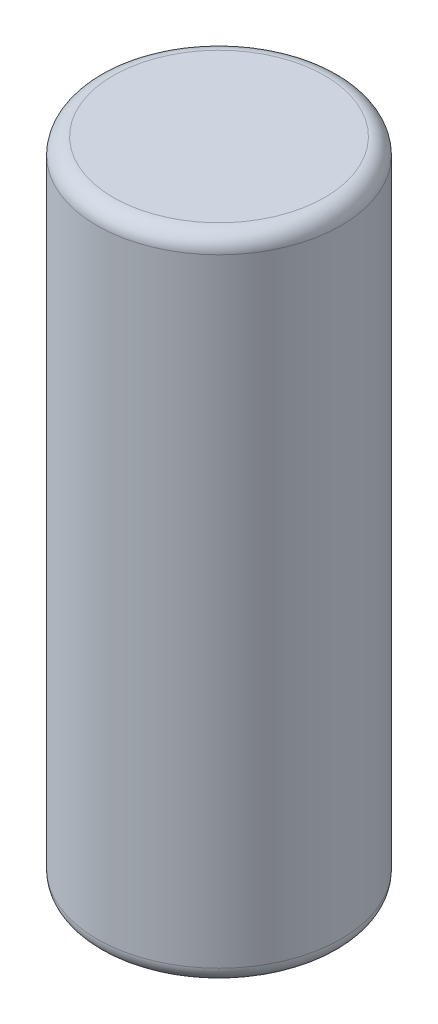
ISO-10303-21;
HEADER;
FILE_DESCRIPTION(('STEP AP214'),'2;1');
FILE_NAME('part.step','',(''),(''),'','','');
FILE_SCHEMA(('AUTOMOTIVE_DESIGN { 1 0 10303 214 1 1 1 1 }'));
ENDSEC;
DATA;
#1=APPLICATION_CONTEXT('core data for automotive mechanical design processes');
#2=APPLICATION_PROTOCOL_DEFINITION('international standard','automotive_design',2000,#1);
#3=PRODUCT_CONTEXT('',#1,'mechanical');
#4=PRODUCT('Part','Part','',(#3));
#5=PRODUCT_RELATED_PRODUCT_CATEGORY('part','',(#4));
#6=PRODUCT_DEFINITION_FORMATION('','',#4);
#7=PRODUCT_DEFINITION_CONTEXT('part definition',#1,'design');
#8=PRODUCT_DEFINITION('design','',#6,#7);
#9=PRODUCT_DEFINITION_SHAPE('','',#8);
#10=(LENGTH_UNIT() NAMED_UNIT(*) SI_UNIT(.MILLI.,.METRE.));
#11=(NAMED_UNIT(*) PLANE_ANGLE_UNIT() SI_UNIT($,.RADIAN.));
#12=(NAMED_UNIT(*) SI_UNIT($,.STERADIAN.) SOLID_ANGLE_UNIT());
#13=UNCERTAINTY_MEASURE_WITH_UNIT(LENGTH_MEASURE(1.E-05),#10,'distance_accuracy_value','');
#14=(GEOMETRIC_REPRESENTATION_CONTEXT(3) GLOBAL_UNCERTAINTY_ASSIGNED_CONTEXT((#13)) GLOBAL_UNIT_ASSIGNED_CONTEXT((#10,
#11,#12)) REPRESENTATION_CONTEXT('',''));
#15=CARTESIAN_POINT('',(0.,0.,0.));
#16=DIRECTION('',(0.,0.,1.));
#17=DIRECTION('',(1.,0.,0.));
#18=AXIS2_PLACEMENT_3D('',#15,#16,#17);
#19=CARTESIAN_POINT('',(0.,400.,0.));
#20=DIRECTION('',(0.,-1.,0.));
#21=DIRECTION('',(0.,0.,-1.));
#22=AXIS2_PLACEMENT_3D('',#19,#20,#21);
#23=CYLINDRICAL_SURFACE('',#22,75.);
#24=CARTESIAN_POINT('',(0.,10.,0.));
#25=DIRECTION('',(0.,1.,0.));
#26=DIRECTION('',(0.,0.,1.));
#27=AXIS2_PLACEMENT_3D('',#24,#25,#26);
#28=CIRCLE('',#27,75.);
#29=CARTESIAN_POINT('',(0.,10.,-75.));
#30=VERTEX_POINT('',#29);
#31=EDGE_CURVE('E43',#30,#30,#28,.T.);
#32=CARTESIAN_POINT('',(0.,390.,0.));
#33=DIRECTION('',(0.,1.,0.));
#34=DIRECTION('',(0.,0.,1.));
#35=AXIS2_PLACEMENT_3D('',#32,#33,#34);
#36=CIRCLE('',#35,75.);
#37=CARTESIAN_POINT('',(0.,390.,-75.));
#38=VERTEX_POINT('',#37);
#39=EDGE_CURVE('E47',#38,#38,#36,.F.);
#40=CARTESIAN_POINT('',(0.,10.,-75.));
#41=CARTESIAN_POINT('',(0.,13.9583333333333,-75.));
#42=CARTESIAN_POINT('',(0.,17.9166666666667,-75.));
#43=CARTESIAN_POINT('',(0.,25.8333333333334,-75.));
#44=CARTESIAN_POINT('',(0.,29.7916666666667,-75.));
#45=CARTESIAN_POINT('',(0.,37.7083333333333,-75.));
#46=CARTESIAN_POINT('',(0.,41.6666666666667,-75.));
#47=CARTESIAN_POINT('',(0.,49.5833333333334,-75.));
#48=CARTESIAN_POINT('',(0.,53.5416666666667,-75.));
#49=CARTESIAN_POINT('',(0.,61.4583333333334,-75.));
#50=CARTESIAN_POINT('',(0.,65.4166666666667,-75.));
#51=CARTESIAN_POINT('',(0.,73.3333333333334,-75.));
#52=CARTESIAN_POINT('',(0.,77.2916666666667,-75.));
#53=CARTESIAN_POINT('',(0.,85.2083333333334,-75.));
#54=CARTESIAN_POINT('',(0.,89.1666666666667,-75.));
#55=CARTESIAN_POINT('',(0.,97.0833333333334,-75.));
#56=CARTESIAN_POINT('',(0.,101.041666666667,-75.));
#57=CARTESIAN_POINT('',(0.,108.958333333333,-75.));
#58=CARTESIAN_POINT('',(0.,112.916666666667,-75.));
#59=CARTESIAN_POINT('',(0.,120.833333333333,-75.));
#60=CARTESIAN_POINT('',(0.,124.791666666667,-75.));
#61=CARTESIAN_POINT('',(0.,132.708333333333,-75.));
#62=CARTESIAN_POINT('',(0.,136.666666666667,-75.));
#63=CARTESIAN_POINT('',(0.,144.583333333333,-75.));
#64=CARTESIAN_POINT('',(0.,148.541666666667,-75.));
#65=CARTESIAN_POINT('',(0.,156.458333333333,-75.));
#66=CARTESIAN_POINT('',(0.,160.416666666667,-75.));
#67=CARTESIAN_POINT('',(0.,168.333333333333,-75.));
#68=CARTESIAN_POINT('',(0.,172.291666666667,-75.));
#69=CARTESIAN_POINT('',(0.,180.208333333333,-75.));
#70=CARTESIAN_POINT('',(0.,184.166666666667,-75.));
#71=CARTESIAN_POINT('',(0.,192.083333333333,-75.));
#72=CARTESIAN_POINT('',(0.,196.041666666667,-75.));
#73=CARTESIAN_POINT('',(0.,203.958333333333,-75.));
#74=CARTESIAN_POINT('',(0.,207.916666666667,-75.));
#75=CARTESIAN_POINT('',(0.,215.833333333333,-75.));
#76=CARTESIAN_POINT('',(0.,219.791666666667,-75.));
#77=CARTESIAN_POINT('',(0.,227.708333333333,-75.));
#78=CARTESIAN_POINT('',(0.,231.666666666667,-75.));
#79=CARTESIAN_POINT('',(0.,239.583333333333,-75.));
#80=CARTESIAN_POINT('',(0.,243.541666666667,-75.));
#81=CARTESIAN_POINT('',(0.,251.458333333333,-75.));
#82=CARTESIAN_POINT('',(0.,255.416666666667,-75.));
#83=CARTESIAN_POINT('',(0.,263.333333333333,-75.));
#84=CARTESIAN_POINT('',(0.,267.291666666667,-75.));
#85=CARTESIAN_POINT('',(0.,275.208333333333,-75.));
#86=CARTESIAN_POINT('',(0.,279.166666666667,-75.));
#87=CARTESIAN_POINT('',(0.,287.083333333333,-75.));
#88=CARTESIAN_POINT('',(0.,291.041666666667,-75.));
#89=CARTESIAN_POINT('',(0.,298.958333333333,-75.));
#90=CARTESIAN_POINT('',(0.,302.916666666667,-75.));
#91=CARTESIAN_POINT('',(0.,310.833333333333,-75.));
#92=CARTESIAN_POINT('',(0.,314.791666666667,-75.));
#93=CARTESIAN_POINT('',(0.,322.708333333333,-75.));
#94=CARTESIAN_POINT('',(0.,326.666666666667,-75.));
#95=CARTESIAN_POINT('',(0.,334.583333333333,-75.));
#96=CARTESIAN_POINT('',(0.,338.541666666667,-75.));
#97=CARTESIAN_POINT('',(0.,346.458333333333,-75.));
#98=CARTESIAN_POINT('',(0.,350.416666666667,-75.));
#99=CARTESIAN_POINT('',(0.,358.333333333333,-75.));
#100=CARTESIAN_POINT('',(0.,362.291666666667,-75.));
#101=CARTESIAN_POINT('',(0.,370.208333333334,-75.));
#102=CARTESIAN_POINT('',(0.,374.166666666667,-75.));
#103=CARTESIAN_POINT('',(0.,382.083333333333,-75.));
#104=CARTESIAN_POINT('',(0.,386.041666666667,-75.));
#105=CARTESIAN_POINT('',(0.,390.,-75.));
#106=B_SPLINE_CURVE_WITH_KNOTS('',3,(#40,#41,#42,#43,#44,#45,#46,#47,#48,#49,#50,#51,#52,#53,
#54,#55,#56,#57,#58,#59,#60,#61,#62,#63,#64,#65,#66,#67,#68,#69,#70,#71,#72,#73,#74,#75,#76,#77,
#78,#79,#80,#81,#82,#83,#84,#85,#86,#87,#88,#89,#90,#91,#92,#93,#94,#95,#96,#97,#98,#99,#100,
#101,#102,#103,#104,#105),.UNSPECIFIED.,.F.,.F.,(4,2,2,2,2,2,2,2,2,2,2,2,2,2,2,2,2,2,2,2,2,2,2,
2,2,2,2,2,2,2,2,2,4),(0.,11.875,23.75,35.625,47.5,59.3750000000001,71.25,83.1250000000001,
95.0000000000001,106.875,118.75,130.625,142.5,154.375,166.25,178.125,190.,201.875,213.75,
225.625,237.5,249.375,261.25,273.125,285.,296.875,308.75,320.625,332.5,344.375,356.25,368.125,
380.),.UNSPECIFIED.);
#107=EDGE_CURVE('BSEAM36',#30,#38,#106,.T.);
#108=ORIENTED_EDGE('',*,*,#31,.T.);
#109=ORIENTED_EDGE('',*,*,#39,.T.);
#110=ORIENTED_EDGE('',*,*,#107,.T.);
#111=ORIENTED_EDGE('',*,*,#107,.F.);
#112=EDGE_LOOP('',(#108,#110,#109,#111));
#113=FACE_BOUND('',#112,.T.);
#114=ADVANCED_FACE('F36',(#113),#23,.T.);
#115=CARTESIAN_POINT('',(0.,400.,0.));
#116=DIRECTION('',(0.,1.,0.));
#117=DIRECTION('',(0.,0.,1.));
#118=AXIS2_PLACEMENT_3D('',#115,#116,#117);
#119=PLANE('',#118);
#120=CARTESIAN_POINT('',(0.,400.,0.));
#121=DIRECTION('',(0.,1.,0.));
#122=DIRECTION('',(0.,0.,1.));
#123=AXIS2_PLACEMENT_3D('',#120,#121,#122);
#124=CIRCLE('',#123,65.);
#125=CARTESIAN_POINT('',(0.,400.,65.));
#126=VERTEX_POINT('',#125);
#127=EDGE_CURVE('E51',#126,#126,#124,.T.);
#128=ORIENTED_EDGE('',*,*,#127,.T.);
#129=EDGE_LOOP('',(#128));
#130=FACE_BOUND('',#129,.T.);
#131=ADVANCED_FACE('F57',(#130),#119,.T.);
#132=CARTESIAN_POINT('',(0.,0.,0.));
#133=DIRECTION('',(0.,1.,0.));
#134=DIRECTION('',(0.,0.,1.));
#135=AXIS2_PLACEMENT_3D('',#132,#133,#134);
#136=PLANE('',#135);
#137=CARTESIAN_POINT('',(0.,0.,0.));
#138=DIRECTION('',(0.,1.,0.));
#139=DIRECTION('',(0.,0.,1.));
#140=AXIS2_PLACEMENT_3D('',#137,#138,#139);
#141=CIRCLE('',#140,65.);
#142=CARTESIAN_POINT('',(0.,0.,65.));
#143=VERTEX_POINT('',#142);
#144=EDGE_CURVE('E10',#143,#143,#141,.F.);
#145=ORIENTED_EDGE('',*,*,#144,.T.);
#146=EDGE_LOOP('',(#145));
#147=FACE_BOUND('',#146,.T.);
#148=ADVANCED_FACE('F61',(#147),#136,.F.);
#149=CARTESIAN_POINT('',(0.,390.,0.));
#150=DIRECTION('',(0.,1.,0.));
#151=DIRECTION('',(0.,0.,1.));
#152=AXIS2_PLACEMENT_3D('',#149,#150,#151);
#153=TOROIDAL_SURFACE('',#152,65.,10.);
#154=ORIENTED_EDGE('',*,*,#39,.F.);
#155=EDGE_LOOP('',(#154));
#156=FACE_BOUND('',#155,.T.);
#157=ORIENTED_EDGE('',*,*,#127,.F.);
#158=EDGE_LOOP('',(#157));
#159=FACE_BOUND('',#158,.T.);
#160=ADVANCED_FACE('F59',(#156,#159),#153,.T.);
#161=CARTESIAN_POINT('',(0.,10.,0.));
#162=DIRECTION('',(0.,1.,0.));
#163=DIRECTION('',(0.,0.,1.));
#164=AXIS2_PLACEMENT_3D('',#161,#162,#163);
#165=TOROIDAL_SURFACE('',#164,65.,10.);
#166=ORIENTED_EDGE('',*,*,#144,.F.);
#167=EDGE_LOOP('',(#166));
#168=FACE_BOUND('',#167,.T.);
#169=ORIENTED_EDGE('',*,*,#31,.F.);
#170=EDGE_LOOP('',(#169));
#171=FACE_BOUND('',#170,.T.);
#172=ADVANCED_FACE('F38',(#168,#171),#165,.T.);
#173=CLOSED_SHELL('',(#114,#131,#148,#160,#172));
#174=MANIFOLD_SOLID_BREP('B2',#173);
#175=ADVANCED_BREP_SHAPE_REPRESENTATION('',(#18,#174),#14);
#176=SHAPE_DEFINITION_REPRESENTATION(#9,#175);
ENDSEC;
END-ISO-10303-21;
